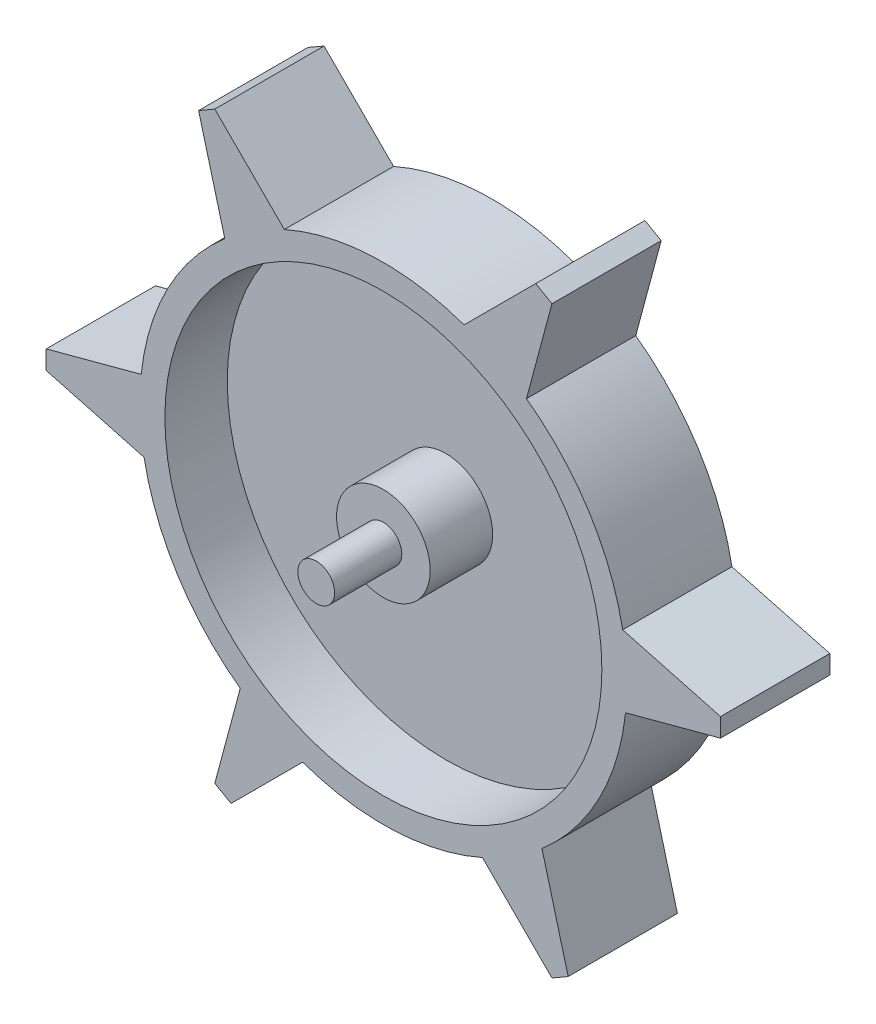
ISO-10303-21;
HEADER;
FILE_DESCRIPTION(('STEP AP214'),'2;1');
FILE_NAME('part.step','',(''),(''),'','','');
FILE_SCHEMA(('AUTOMOTIVE_DESIGN { 1 0 10303 214 1 1 1 1 }'));
ENDSEC;
DATA;
#1=APPLICATION_CONTEXT('core data for automotive mechanical design processes');
#2=APPLICATION_PROTOCOL_DEFINITION('international standard','automotive_design',2000,#1);
#3=PRODUCT_CONTEXT('',#1,'mechanical');
#4=PRODUCT('Part','Part','',(#3));
#5=PRODUCT_RELATED_PRODUCT_CATEGORY('part','',(#4));
#6=PRODUCT_DEFINITION_FORMATION('','',#4);
#7=PRODUCT_DEFINITION_CONTEXT('part definition',#1,'design');
#8=PRODUCT_DEFINITION('design','',#6,#7);
#9=PRODUCT_DEFINITION_SHAPE('','',#8);
#10=(LENGTH_UNIT() NAMED_UNIT(*) SI_UNIT(.MILLI.,.METRE.));
#11=(NAMED_UNIT(*) PLANE_ANGLE_UNIT() SI_UNIT($,.RADIAN.));
#12=(NAMED_UNIT(*) SI_UNIT($,.STERADIAN.) SOLID_ANGLE_UNIT());
#13=UNCERTAINTY_MEASURE_WITH_UNIT(LENGTH_MEASURE(1.E-05),#10,'distance_accuracy_value','');
#14=(GEOMETRIC_REPRESENTATION_CONTEXT(3) GLOBAL_UNCERTAINTY_ASSIGNED_CONTEXT((#13)) GLOBAL_UNIT_ASSIGNED_CONTEXT((#10,
#11,#12)) REPRESENTATION_CONTEXT('',''));
#15=CARTESIAN_POINT('',(0.,0.,0.));
#16=DIRECTION('',(0.,0.,1.));
#17=DIRECTION('',(1.,0.,0.));
#18=AXIS2_PLACEMENT_3D('',#15,#16,#17);
#19=CARTESIAN_POINT('',(0.,0.,17.5));
#20=DIRECTION('',(0.,0.,-1.));
#21=DIRECTION('',(-1.,0.,0.));
#22=AXIS2_PLACEMENT_3D('',#19,#20,#21);
#23=CYLINDRICAL_SURFACE('',#22,39.);
#24=DIRECTION('',(0.,0.,-1.));
#25=VECTOR('',#24,1.);
#26=CARTESIAN_POINT('',(-12.9305760104511,-36.7940240261642,17.5));
#27=LINE('',#26,#25);
#28=CARTESIAN_POINT('',(-12.930576010451,-36.7940240261642,17.5));
#29=VERTEX_POINT('',#28);
#30=CARTESIAN_POINT('',(-12.9305760104511,-36.7940240261642,0.));
#31=VERTEX_POINT('',#30);
#32=EDGE_CURVE('E381',#29,#31,#27,.T.);
#33=ORIENTED_EDGE('',*,*,#32,.T.);
#34=CARTESIAN_POINT('',(0.,0.,0.));
#35=DIRECTION('',(0.,0.,1.));
#36=DIRECTION('',(1.,0.,0.));
#37=AXIS2_PLACEMENT_3D('',#34,#35,#36);
#38=CIRCLE('',#37,39.);
#39=CARTESIAN_POINT('',(15.862848067013,-35.6282198713725,0.));
#40=VERTEX_POINT('',#39);
#41=EDGE_CURVE('E461',#31,#40,#38,.T.);
#42=ORIENTED_EDGE('',*,*,#41,.T.);
#43=DIRECTION('',(0.,0.,-1.));
#44=VECTOR('',#43,1.);
#45=CARTESIAN_POINT('',(15.862848067013,-35.6282198713725,17.5));
#46=LINE('',#45,#44);
#47=CARTESIAN_POINT('',(15.862848067013,-35.6282198713725,17.5));
#48=VERTEX_POINT('',#47);
#49=EDGE_CURVE('E364',#48,#40,#46,.T.);
#50=ORIENTED_EDGE('',*,*,#49,.F.);
#51=CARTESIAN_POINT('',(0.,0.,17.5));
#52=DIRECTION('',(0.,0.,1.));
#53=DIRECTION('',(1.,0.,0.));
#54=AXIS2_PLACEMENT_3D('',#51,#52,#53);
#55=CIRCLE('',#54,39.);
#56=EDGE_CURVE('E445',#29,#48,#55,.T.);
#57=ORIENTED_EDGE('',*,*,#56,.F.);
#58=EDGE_LOOP('',(#33,#42,#50,#57));
#59=FACE_BOUND('',#58,.T.);
#60=ADVANCED_FACE('F46',(#59),#23,.T.);
#61=DIRECTION('',(0.,0.,-1.));
#62=VECTOR('',#61,1.);
#63=CARTESIAN_POINT('',(38.3298475193387,7.19880470246576,17.5));
#64=LINE('',#63,#62);
#65=CARTESIAN_POINT('',(38.3298475193387,7.19880470246577,17.5));
#66=VERTEX_POINT('',#65);
#67=CARTESIAN_POINT('',(38.3298475193387,7.19880470246577,0.));
#68=VERTEX_POINT('',#67);
#69=EDGE_CURVE('E310',#66,#68,#64,.T.);
#70=ORIENTED_EDGE('',*,*,#69,.T.);
#71=CARTESIAN_POINT('',(22.9235194667195,31.5517393380925,0.));
#72=VERTEX_POINT('',#71);
#73=EDGE_CURVE('E545',#68,#72,#38,.T.);
#74=ORIENTED_EDGE('',*,*,#73,.T.);
#75=DIRECTION('',(0.,0.,-1.));
#76=VECTOR('',#75,1.);
#77=CARTESIAN_POINT('',(22.9235194667195,31.5517393380925,17.5));
#78=LINE('',#77,#76);
#79=CARTESIAN_POINT('',(22.9235194667195,31.5517393380925,17.5));
#80=VERTEX_POINT('',#79);
#81=EDGE_CURVE('E296',#80,#72,#78,.T.);
#82=ORIENTED_EDGE('',*,*,#81,.F.);
#83=EDGE_CURVE('E509',#66,#80,#55,.T.);
#84=ORIENTED_EDGE('',*,*,#83,.F.);
#85=EDGE_LOOP('',(#70,#74,#82,#84));
#86=FACE_BOUND('',#85,.T.);
#87=ADVANCED_FACE('F575',(#86),#23,.T.);
#88=DIRECTION('',(0.,0.,-1.));
#89=VECTOR('',#88,1.);
#90=CARTESIAN_POINT('',(-25.3992715088879,29.5952193236981,17.5));
#91=LINE('',#90,#89);
#92=CARTESIAN_POINT('',(-25.3992715088879,29.5952193236981,17.5));
#93=VERTEX_POINT('',#92);
#94=CARTESIAN_POINT('',(-25.3992715088879,29.5952193236981,0.));
#95=VERTEX_POINT('',#94);
#96=EDGE_CURVE('E254',#93,#95,#91,.T.);
#97=ORIENTED_EDGE('',*,*,#96,.T.);
#98=CARTESIAN_POINT('',(-38.7863675337326,4.07648053328027,0.));
#99=VERTEX_POINT('',#98);
#100=EDGE_CURVE('E439',#95,#99,#38,.T.);
#101=ORIENTED_EDGE('',*,*,#100,.T.);
#102=DIRECTION('',(0.,0.,-1.));
#103=VECTOR('',#102,1.);
#104=CARTESIAN_POINT('',(-38.7863675337326,4.07648053328027,17.5));
#105=LINE('',#104,#103);
#106=CARTESIAN_POINT('',(-38.7863675337326,4.07648053328027,17.5));
#107=VERTEX_POINT('',#106);
#108=EDGE_CURVE('E55',#107,#99,#105,.T.);
#109=ORIENTED_EDGE('',*,*,#108,.F.);
#110=EDGE_CURVE('E446',#93,#107,#55,.T.);
#111=ORIENTED_EDGE('',*,*,#110,.F.);
#112=EDGE_LOOP('',(#97,#101,#109,#111));
#113=FACE_BOUND('',#112,.T.);
#114=ADVANCED_FACE('F557',(#113),#23,.T.);
#115=CARTESIAN_POINT('',(12.9305760104508,36.7940240261643,0.));
#116=VERTEX_POINT('',#115);
#117=CARTESIAN_POINT('',(-15.8628480670133,35.6282198713724,0.));
#118=VERTEX_POINT('',#117);
#119=EDGE_CURVE('E549',#116,#118,#38,.T.);
#120=ORIENTED_EDGE('',*,*,#119,.T.);
#121=DIRECTION('',(0.,0.,-1.));
#122=VECTOR('',#121,1.);
#123=CARTESIAN_POINT('',(-15.8628480670133,35.6282198713724,17.5));
#124=LINE('',#123,#122);
#125=CARTESIAN_POINT('',(-15.8628480670133,35.6282198713724,17.5));
#126=VERTEX_POINT('',#125);
#127=EDGE_CURVE('E226',#126,#118,#124,.T.);
#128=ORIENTED_EDGE('',*,*,#127,.F.);
#129=CARTESIAN_POINT('',(12.9305760104508,36.7940240261643,17.5));
#130=VERTEX_POINT('',#129);
#131=EDGE_CURVE('E241',#130,#126,#55,.T.);
#132=ORIENTED_EDGE('',*,*,#131,.F.);
#133=DIRECTION('',(0.,0.,-1.));
#134=VECTOR('',#133,1.);
#135=CARTESIAN_POINT('',(12.9305760104508,36.7940240261643,17.5));
#136=LINE('',#135,#134);
#137=EDGE_CURVE('E277',#130,#116,#136,.T.);
#138=ORIENTED_EDGE('',*,*,#137,.T.);
#139=EDGE_LOOP('',(#120,#128,#132,#138));
#140=FACE_BOUND('',#139,.T.);
#141=ADVANCED_FACE('F568',(#140),#23,.T.);
#142=CARTESIAN_POINT('',(25.3992715088877,-29.5952193236983,0.));
#143=VERTEX_POINT('',#142);
#144=CARTESIAN_POINT('',(38.7863675337326,-4.07648053328028,0.));
#145=VERTEX_POINT('',#144);
#146=EDGE_CURVE('E541',#143,#145,#38,.T.);
#147=ORIENTED_EDGE('',*,*,#146,.T.);
#148=DIRECTION('',(0.,0.,-1.));
#149=VECTOR('',#148,1.);
#150=CARTESIAN_POINT('',(38.7863675337326,-4.07648053328027,17.5));
#151=LINE('',#150,#149);
#152=CARTESIAN_POINT('',(38.7863675337326,-4.07648053328028,17.5));
#153=VERTEX_POINT('',#152);
#154=EDGE_CURVE('E329',#153,#145,#151,.T.);
#155=ORIENTED_EDGE('',*,*,#154,.F.);
#156=CARTESIAN_POINT('',(25.3992715088877,-29.5952193236983,17.5));
#157=VERTEX_POINT('',#156);
#158=EDGE_CURVE('E512',#157,#153,#55,.T.);
#159=ORIENTED_EDGE('',*,*,#158,.F.);
#160=DIRECTION('',(0.,0.,-1.));
#161=VECTOR('',#160,1.);
#162=CARTESIAN_POINT('',(25.3992715088877,-29.5952193236983,17.5));
#163=LINE('',#162,#161);
#164=EDGE_CURVE('E345',#157,#143,#163,.T.);
#165=ORIENTED_EDGE('',*,*,#164,.T.);
#166=EDGE_LOOP('',(#147,#155,#159,#165));
#167=FACE_BOUND('',#166,.T.);
#168=ADVANCED_FACE('F539',(#167),#23,.T.);
#169=CARTESIAN_POINT('',(0.,0.,-10.75));
#170=DIRECTION('',(0.,0.,1.));
#171=DIRECTION('',(1.,0.,0.));
#172=AXIS2_PLACEMENT_3D('',#169,#170,#171);
#173=PLANE('',#172);
#174=CARTESIAN_POINT('',(0.,0.,-10.75));
#175=DIRECTION('',(0.,0.,1.));
#176=DIRECTION('',(1.,0.,0.));
#177=AXIS2_PLACEMENT_3D('',#174,#175,#176);
#178=CIRCLE('',#177,2.95);
#179=CARTESIAN_POINT('',(2.95,0.,-10.75));
#180=VERTEX_POINT('',#179);
#181=EDGE_CURVE('E427',#180,#180,#178,.T.);
#182=ORIENTED_EDGE('',*,*,#181,.F.);
#183=EDGE_LOOP('',(#182));
#184=FACE_BOUND('',#183,.T.);
#185=CARTESIAN_POINT('',(0.,0.,-10.75));
#186=DIRECTION('',(0.,0.,1.));
#187=DIRECTION('',(1.,0.,0.));
#188=AXIS2_PLACEMENT_3D('',#185,#186,#187);
#189=CIRCLE('',#188,1.7);
#190=CARTESIAN_POINT('',(1.22376468326227,-1.18,-10.75));
#191=VERTEX_POINT('',#190);
#192=CARTESIAN_POINT('',(-1.22376468326227,-1.18,-10.75));
#193=VERTEX_POINT('',#192);
#194=EDGE_CURVE('E405',#191,#193,#189,.T.);
#195=ORIENTED_EDGE('',*,*,#194,.T.);
#196=DIRECTION('',(-1.,0.,0.));
#197=VECTOR('',#196,1.);
#198=CARTESIAN_POINT('',(0.,-1.18,-10.75));
#199=LINE('',#198,#197);
#200=EDGE_CURVE('E410',#191,#193,#199,.T.);
#201=ORIENTED_EDGE('',*,*,#200,.F.);
#202=EDGE_LOOP('',(#195,#201));
#203=FACE_BOUND('',#202,.T.);
#204=ADVANCED_FACE('F574',(#184,#203),#173,.F.);
#205=CARTESIAN_POINT('',(-38.3298475193387,-7.19880470246576,0.));
#206=VERTEX_POINT('',#205);
#207=CARTESIAN_POINT('',(-22.9235194667197,-31.5517393380923,0.));
#208=VERTEX_POINT('',#207);
#209=EDGE_CURVE('E457',#206,#208,#38,.T.);
#210=ORIENTED_EDGE('',*,*,#209,.T.);
#211=DIRECTION('',(0.,0.,-1.));
#212=VECTOR('',#211,1.);
#213=CARTESIAN_POINT('',(-22.9235194667197,-31.5517393380923,17.5));
#214=LINE('',#213,#212);
#215=CARTESIAN_POINT('',(-22.9235194667197,-31.5517393380923,17.5));
#216=VERTEX_POINT('',#215);
#217=EDGE_CURVE('E401',#216,#208,#214,.T.);
#218=ORIENTED_EDGE('',*,*,#217,.F.);
#219=CARTESIAN_POINT('',(-38.3298475193387,-7.19880470246576,17.5));
#220=VERTEX_POINT('',#219);
#221=EDGE_CURVE('E440',#220,#216,#55,.T.);
#222=ORIENTED_EDGE('',*,*,#221,.F.);
#223=DIRECTION('',(0.,0.,-1.));
#224=VECTOR('',#223,1.);
#225=CARTESIAN_POINT('',(-38.3298475193387,-7.19880470246576,17.5));
#226=LINE('',#225,#224);
#227=EDGE_CURVE('E456',#220,#206,#226,.T.);
#228=ORIENTED_EDGE('',*,*,#227,.T.);
#229=EDGE_LOOP('',(#210,#218,#222,#228));
#230=FACE_BOUND('',#229,.T.);
#231=ADVANCED_FACE('F48',(#230),#23,.T.);
#232=CARTESIAN_POINT('',(-3.61731409782018,13.5,17.5));
#233=DIRECTION('',(-0.258819045102522,0.965925826289068,0.));
#234=DIRECTION('',(-0.965925826289068,-0.258819045102522,0.));
#235=AXIS2_PLACEMENT_3D('',#232,#233,#234);
#236=PLANE('',#235);
#237=DIRECTION('',(0.965925826289068,0.258819045102522,0.));
#238=VECTOR('',#237,1.);
#239=CARTESIAN_POINT('',(-3.61731409782018,13.5,0.));
#240=LINE('',#239,#238);
#241=CARTESIAN_POINT('',(-54.,0.,0.));
#242=VERTEX_POINT('',#241);
#243=EDGE_CURVE('E460',#242,#99,#240,.T.);
#244=ORIENTED_EDGE('',*,*,#243,.F.);
#245=DIRECTION('',(0.,0.,-1.));
#246=VECTOR('',#245,1.);
#247=CARTESIAN_POINT('',(-54.,0.,17.5));
#248=LINE('',#247,#246);
#249=CARTESIAN_POINT('',(-54.,0.,17.5));
#250=VERTEX_POINT('',#249);
#251=EDGE_CURVE('E478',#250,#242,#248,.T.);
#252=ORIENTED_EDGE('',*,*,#251,.F.);
#253=DIRECTION('',(0.965925826289068,0.258819045102522,0.));
#254=VECTOR('',#253,1.);
#255=CARTESIAN_POINT('',(-3.61731409782018,13.5,17.5));
#256=LINE('',#255,#254);
#257=EDGE_CURVE('E444',#250,#107,#256,.T.);
#258=ORIENTED_EDGE('',*,*,#257,.T.);
#259=ORIENTED_EDGE('',*,*,#108,.T.);
#260=EDGE_LOOP('',(#244,#252,#258,#259));
#261=FACE_BOUND('',#260,.T.);
#262=ADVANCED_FACE('F485',(#261),#236,.T.);
#263=CARTESIAN_POINT('',(-54.,0.,17.5));
#264=DIRECTION('',(1.,0.,0.));
#265=DIRECTION('',(0.,0.,-1.));
#266=AXIS2_PLACEMENT_3D('',#263,#264,#265);
#267=PLANE('',#266);
#268=DIRECTION('',(0.,-1.,0.));
#269=VECTOR('',#268,1.);
#270=CARTESIAN_POINT('',(-54.,0.,0.));
#271=LINE('',#270,#269);
#272=CARTESIAN_POINT('',(-54.,-3.,0.));
#273=VERTEX_POINT('',#272);
#274=EDGE_CURVE('E465',#242,#273,#271,.T.);
#275=ORIENTED_EDGE('',*,*,#274,.T.);
#276=DIRECTION('',(0.,0.,-1.));
#277=VECTOR('',#276,1.);
#278=CARTESIAN_POINT('',(-54.,-3.,17.5));
#279=LINE('',#278,#277);
#280=CARTESIAN_POINT('',(-54.,-3.,17.5));
#281=VERTEX_POINT('',#280);
#282=EDGE_CURVE('E474',#281,#273,#279,.T.);
#283=ORIENTED_EDGE('',*,*,#282,.F.);
#284=DIRECTION('',(0.,-1.,0.));
#285=VECTOR('',#284,1.);
#286=CARTESIAN_POINT('',(-54.,0.,17.5));
#287=LINE('',#286,#285);
#288=EDGE_CURVE('E450',#250,#281,#287,.T.);
#289=ORIENTED_EDGE('',*,*,#288,.F.);
#290=ORIENTED_EDGE('',*,*,#251,.T.);
#291=EDGE_LOOP('',(#275,#283,#289,#290));
#292=FACE_BOUND('',#291,.T.);
#293=ADVANCED_FACE('F498',(#292),#267,.F.);
#294=CARTESIAN_POINT('',(-4.36731409782018,-16.2990381056767,17.5));
#295=DIRECTION('',(0.258819045102522,0.965925826289068,0.));
#296=DIRECTION('',(-0.965925826289068,0.258819045102522,0.));
#297=AXIS2_PLACEMENT_3D('',#294,#295,#296);
#298=PLANE('',#297);
#299=DIRECTION('',(0.965925826289068,-0.258819045102522,0.));
#300=VECTOR('',#299,1.);
#301=CARTESIAN_POINT('',(-4.36731409782018,-16.2990381056767,0.));
#302=LINE('',#301,#300);
#303=EDGE_CURVE('E468',#273,#206,#302,.T.);
#304=ORIENTED_EDGE('',*,*,#303,.T.);
#305=ORIENTED_EDGE('',*,*,#227,.F.);
#306=DIRECTION('',(0.965925826289068,-0.258819045102522,0.));
#307=VECTOR('',#306,1.);
#308=CARTESIAN_POINT('',(-4.36731409782018,-16.2990381056767,17.5));
#309=LINE('',#308,#307);
#310=EDGE_CURVE('E453',#281,#220,#309,.T.);
#311=ORIENTED_EDGE('',*,*,#310,.F.);
#312=ORIENTED_EDGE('',*,*,#282,.T.);
#313=EDGE_LOOP('',(#304,#305,#311,#312));
#314=FACE_BOUND('',#313,.T.);
#315=ADVANCED_FACE('F502',(#314),#298,.F.);
#316=CARTESIAN_POINT('',(0.,0.,17.5));
#317=DIRECTION('',(0.,0.,1.));
#318=DIRECTION('',(1.,0.,0.));
#319=AXIS2_PLACEMENT_3D('',#316,#317,#318);
#320=PLANE('',#319);
#321=CARTESIAN_POINT('',(0.,0.,17.5));
#322=DIRECTION('',(0.,0.,1.));
#323=DIRECTION('',(1.,0.,0.));
#324=AXIS2_PLACEMENT_3D('',#321,#322,#323);
#325=CIRCLE('',#324,35.);
#326=CARTESIAN_POINT('',(35.,0.,17.5));
#327=VERTEX_POINT('',#326);
#328=EDGE_CURVE('E249',#327,#327,#325,.T.);
#329=ORIENTED_EDGE('',*,*,#328,.F.);
#330=EDGE_LOOP('',(#329));
#331=FACE_BOUND('',#330,.T.);
#332=ORIENTED_EDGE('',*,*,#110,.T.);
#333=ORIENTED_EDGE('',*,*,#257,.F.);
#334=ORIENTED_EDGE('',*,*,#288,.T.);
#335=ORIENTED_EDGE('',*,*,#310,.T.);
#336=ORIENTED_EDGE('',*,*,#221,.T.);
#337=DIRECTION('',(0.258819045102518,0.965925826289069,0.));
#338=VECTOR('',#337,1.);
#339=CARTESIAN_POINT('',(-13.5000000000001,3.61731409782013,17.5));
#340=LINE('',#339,#338);
#341=CARTESIAN_POINT('',(-26.9999999999999,-46.7653718043598,17.5));
#342=VERTEX_POINT('',#341);
#343=EDGE_CURVE('E369',#342,#216,#340,.T.);
#344=ORIENTED_EDGE('',*,*,#343,.F.);
#345=DIRECTION('',(0.86602540378444,-0.499999999999998,0.));
#346=VECTOR('',#345,1.);
#347=CARTESIAN_POINT('',(-26.9999999999999,-46.7653718043598,17.5));
#348=LINE('',#347,#346);
#349=CARTESIAN_POINT('',(-24.4019237886466,-48.2653718043597,17.5));
#350=VERTEX_POINT('',#349);
#351=EDGE_CURVE('E373',#342,#350,#348,.T.);
#352=ORIENTED_EDGE('',*,*,#351,.T.);
#353=DIRECTION('',(0.707106781186547,0.707106781186549,0.));
#354=VECTOR('',#353,1.);
#355=CARTESIAN_POINT('',(11.9317240078566,-11.9317240078565,17.5));
#356=LINE('',#355,#354);
#357=EDGE_CURVE('E377',#350,#29,#356,.T.);
#358=ORIENTED_EDGE('',*,*,#357,.T.);
#359=ORIENTED_EDGE('',*,*,#56,.T.);
#360=DIRECTION('',(-0.707106781186552,0.707106781186544,0.));
#361=VECTOR('',#360,1.);
#362=CARTESIAN_POINT('',(-9.88268590217982,-9.88268590217993,17.5));
#363=LINE('',#362,#361);
#364=CARTESIAN_POINT('',(27.0000000000002,-46.7653718043596,17.5));
#365=VERTEX_POINT('',#364);
#366=EDGE_CURVE('E333',#365,#48,#363,.T.);
#367=ORIENTED_EDGE('',*,*,#366,.F.);
#368=DIRECTION('',(0.866025403784436,0.500000000000004,0.));
#369=VECTOR('',#368,1.);
#370=CARTESIAN_POINT('',(27.0000000000002,-46.7653718043596,17.5));
#371=LINE('',#370,#369);
#372=CARTESIAN_POINT('',(29.5980762113535,-45.2653718043596,17.5));
#373=VERTEX_POINT('',#372);
#374=EDGE_CURVE('E337',#365,#373,#371,.T.);
#375=ORIENTED_EDGE('',*,*,#374,.T.);
#376=DIRECTION('',(-0.258819045102524,0.965925826289068,0.));
#377=VECTOR('',#376,1.);
#378=CARTESIAN_POINT('',(16.2990381056767,4.36731409782023,17.5));
#379=LINE('',#378,#377);
#380=EDGE_CURVE('E341',#373,#157,#379,.T.);
#381=ORIENTED_EDGE('',*,*,#380,.T.);
#382=ORIENTED_EDGE('',*,*,#158,.T.);
#383=DIRECTION('',(-0.965925826289068,-0.258819045102522,0.));
#384=VECTOR('',#383,1.);
#385=CARTESIAN_POINT('',(3.61731409782018,-13.5,17.5));
#386=LINE('',#385,#384);
#387=CARTESIAN_POINT('',(54.,0.,17.5));
#388=VERTEX_POINT('',#387);
#389=EDGE_CURVE('E300',#388,#153,#386,.T.);
#390=ORIENTED_EDGE('',*,*,#389,.F.);
#391=DIRECTION('',(0.,1.,0.));
#392=VECTOR('',#391,1.);
#393=CARTESIAN_POINT('',(54.,0.,17.5));
#394=LINE('',#393,#392);
#395=CARTESIAN_POINT('',(54.,3.,17.5));
#396=VERTEX_POINT('',#395);
#397=EDGE_CURVE('E303',#388,#396,#394,.T.);
#398=ORIENTED_EDGE('',*,*,#397,.T.);
#399=DIRECTION('',(-0.965925826289068,0.258819045102522,0.));
#400=VECTOR('',#399,1.);
#401=CARTESIAN_POINT('',(4.36731409782018,16.2990381056767,17.5));
#402=LINE('',#401,#400);
#403=EDGE_CURVE('E307',#396,#66,#402,.T.);
#404=ORIENTED_EDGE('',*,*,#403,.T.);
#405=ORIENTED_EDGE('',*,*,#83,.T.);
#406=DIRECTION('',(-0.258819045102511,-0.965925826289071,0.));
#407=VECTOR('',#406,1.);
#408=CARTESIAN_POINT('',(13.5000000000001,-3.61731409782003,17.5));
#409=LINE('',#408,#407);
#410=CARTESIAN_POINT('',(26.9999999999996,46.7653718043599,17.5));
#411=VERTEX_POINT('',#410);
#412=EDGE_CURVE('E70',#411,#80,#409,.T.);
#413=ORIENTED_EDGE('',*,*,#412,.F.);
#414=DIRECTION('',(-0.866025403784443,0.499999999999992,0.));
#415=VECTOR('',#414,1.);
#416=CARTESIAN_POINT('',(26.9999999999996,46.7653718043599,17.5));
#417=LINE('',#416,#415);
#418=CARTESIAN_POINT('',(24.4019237886462,48.2653718043599,17.5));
#419=VERTEX_POINT('',#418);
#420=EDGE_CURVE('E270',#411,#419,#417,.T.);
#421=ORIENTED_EDGE('',*,*,#420,.T.);
#422=DIRECTION('',(-0.707106781186542,-0.707106781186553,0.));
#423=VECTOR('',#422,1.);
#424=CARTESIAN_POINT('',(-11.9317240078566,11.9317240078564,17.5));
#425=LINE('',#424,#423);
#426=EDGE_CURVE('E274',#419,#130,#425,.T.);
#427=ORIENTED_EDGE('',*,*,#426,.T.);
#428=ORIENTED_EDGE('',*,*,#131,.T.);
#429=DIRECTION('',(0.707106781186556,-0.707106781186539,0.));
#430=VECTOR('',#429,1.);
#431=CARTESIAN_POINT('',(9.88268590217975,9.88268590218,17.5));
#432=LINE('',#431,#430);
#433=CARTESIAN_POINT('',(-27.0000000000005,46.7653718043594,17.5));
#434=VERTEX_POINT('',#433);
#435=EDGE_CURVE('E62',#434,#126,#432,.T.);
#436=ORIENTED_EDGE('',*,*,#435,.F.);
#437=DIRECTION('',(-0.866025403784433,-0.50000000000001,0.));
#438=VECTOR('',#437,1.);
#439=CARTESIAN_POINT('',(-27.0000000000005,46.7653718043594,17.5));
#440=LINE('',#439,#438);
#441=CARTESIAN_POINT('',(-29.5980762113538,45.2653718043593,17.5));
#442=VERTEX_POINT('',#441);
#443=EDGE_CURVE('E230',#434,#442,#440,.T.);
#444=ORIENTED_EDGE('',*,*,#443,.T.);
#445=DIRECTION('',(0.258819045102531,-0.965925826289066,0.));
#446=VECTOR('',#445,1.);
#447=CARTESIAN_POINT('',(-16.2990381056767,-4.36731409782034,17.5));
#448=LINE('',#447,#446);
#449=EDGE_CURVE('E236',#442,#93,#448,.T.);
#450=ORIENTED_EDGE('',*,*,#449,.T.);
#451=EDGE_LOOP('',(#332,#333,#334,#335,#336,#344,#352,#358,#359,#367,#375,#381,#382,#390,#398,
#404,#405,#413,#421,#427,#428,#436,#444,#450));
#452=FACE_BOUND('',#451,.T.);
#453=ADVANCED_FACE('F239',(#331,#452),#320,.T.);
#454=CARTESIAN_POINT('',(0.,0.,0.));
#455=DIRECTION('',(0.,0.,1.));
#456=DIRECTION('',(1.,0.,0.));
#457=AXIS2_PLACEMENT_3D('',#454,#455,#456);
#458=PLANE('',#457);
#459=CARTESIAN_POINT('',(0.,0.,0.));
#460=DIRECTION('',(0.,0.,1.));
#461=DIRECTION('',(1.,0.,0.));
#462=AXIS2_PLACEMENT_3D('',#459,#460,#461);
#463=CIRCLE('',#462,2.95);
#464=CARTESIAN_POINT('',(2.95,0.,0.));
#465=VERTEX_POINT('',#464);
#466=EDGE_CURVE('E11',#465,#465,#463,.F.);
#467=ORIENTED_EDGE('',*,*,#466,.F.);
#468=EDGE_LOOP('',(#467));
#469=FACE_BOUND('',#468,.T.);
#470=ORIENTED_EDGE('',*,*,#209,.F.);
#471=ORIENTED_EDGE('',*,*,#303,.F.);
#472=ORIENTED_EDGE('',*,*,#274,.F.);
#473=ORIENTED_EDGE('',*,*,#243,.T.);
#474=ORIENTED_EDGE('',*,*,#100,.F.);
#475=DIRECTION('',(0.258819045102531,-0.965925826289066,0.));
#476=VECTOR('',#475,1.);
#477=CARTESIAN_POINT('',(-16.2990381056767,-4.36731409782034,0.));
#478=LINE('',#477,#476);
#479=CARTESIAN_POINT('',(-29.5980762113538,45.2653718043593,0.));
#480=VERTEX_POINT('',#479);
#481=EDGE_CURVE('E243',#480,#95,#478,.T.);
#482=ORIENTED_EDGE('',*,*,#481,.F.);
#483=DIRECTION('',(-0.866025403784433,-0.50000000000001,0.));
#484=VECTOR('',#483,1.);
#485=CARTESIAN_POINT('',(-27.0000000000005,46.7653718043594,0.));
#486=LINE('',#485,#484);
#487=CARTESIAN_POINT('',(-27.0000000000005,46.7653718043594,0.));
#488=VERTEX_POINT('',#487);
#489=EDGE_CURVE('E246',#488,#480,#486,.T.);
#490=ORIENTED_EDGE('',*,*,#489,.F.);
#491=DIRECTION('',(0.707106781186556,-0.707106781186539,0.));
#492=VECTOR('',#491,1.);
#493=CARTESIAN_POINT('',(9.88268590217975,9.88268590218,0.));
#494=LINE('',#493,#492);
#495=EDGE_CURVE('E222',#488,#118,#494,.T.);
#496=ORIENTED_EDGE('',*,*,#495,.T.);
#497=ORIENTED_EDGE('',*,*,#119,.F.);
#498=DIRECTION('',(-0.707106781186542,-0.707106781186553,0.));
#499=VECTOR('',#498,1.);
#500=CARTESIAN_POINT('',(-11.9317240078566,11.9317240078564,0.));
#501=LINE('',#500,#499);
#502=CARTESIAN_POINT('',(24.4019237886462,48.2653718043599,0.));
#503=VERTEX_POINT('',#502);
#504=EDGE_CURVE('E271',#503,#116,#501,.T.);
#505=ORIENTED_EDGE('',*,*,#504,.F.);
#506=DIRECTION('',(-0.866025403784443,0.499999999999992,0.));
#507=VECTOR('',#506,1.);
#508=CARTESIAN_POINT('',(26.9999999999996,46.7653718043599,0.));
#509=LINE('',#508,#507);
#510=CARTESIAN_POINT('',(26.9999999999996,46.7653718043599,0.));
#511=VERTEX_POINT('',#510);
#512=EDGE_CURVE('E281',#511,#503,#509,.T.);
#513=ORIENTED_EDGE('',*,*,#512,.F.);
#514=DIRECTION('',(-0.258819045102511,-0.965925826289071,0.));
#515=VECTOR('',#514,1.);
#516=CARTESIAN_POINT('',(13.5000000000001,-3.61731409782003,0.));
#517=LINE('',#516,#515);
#518=EDGE_CURVE('E267',#511,#72,#517,.T.);
#519=ORIENTED_EDGE('',*,*,#518,.T.);
#520=ORIENTED_EDGE('',*,*,#73,.F.);
#521=DIRECTION('',(-0.965925826289068,0.258819045102522,0.));
#522=VECTOR('',#521,1.);
#523=CARTESIAN_POINT('',(4.36731409782018,16.2990381056767,0.));
#524=LINE('',#523,#522);
#525=CARTESIAN_POINT('',(54.,3.,0.));
#526=VERTEX_POINT('',#525);
#527=EDGE_CURVE('E304',#526,#68,#524,.T.);
#528=ORIENTED_EDGE('',*,*,#527,.F.);
#529=DIRECTION('',(0.,1.,0.));
#530=VECTOR('',#529,1.);
#531=CARTESIAN_POINT('',(54.,0.,0.));
#532=LINE('',#531,#530);
#533=CARTESIAN_POINT('',(54.,0.,0.));
#534=VERTEX_POINT('',#533);
#535=EDGE_CURVE('E314',#534,#526,#532,.T.);
#536=ORIENTED_EDGE('',*,*,#535,.F.);
#537=DIRECTION('',(-0.965925826289068,-0.258819045102522,0.));
#538=VECTOR('',#537,1.);
#539=CARTESIAN_POINT('',(3.61731409782018,-13.5,0.));
#540=LINE('',#539,#538);
#541=EDGE_CURVE('E299',#534,#145,#540,.T.);
#542=ORIENTED_EDGE('',*,*,#541,.T.);
#543=ORIENTED_EDGE('',*,*,#146,.F.);
#544=DIRECTION('',(-0.258819045102524,0.965925826289068,0.));
#545=VECTOR('',#544,1.);
#546=CARTESIAN_POINT('',(16.2990381056767,4.36731409782023,0.));
#547=LINE('',#546,#545);
#548=CARTESIAN_POINT('',(29.5980762113535,-45.2653718043596,0.));
#549=VERTEX_POINT('',#548);
#550=EDGE_CURVE('E338',#549,#143,#547,.T.);
#551=ORIENTED_EDGE('',*,*,#550,.F.);
#552=DIRECTION('',(0.866025403784436,0.500000000000004,0.));
#553=VECTOR('',#552,1.);
#554=CARTESIAN_POINT('',(27.0000000000002,-46.7653718043596,0.));
#555=LINE('',#554,#553);
#556=CARTESIAN_POINT('',(27.0000000000002,-46.7653718043596,0.));
#557=VERTEX_POINT('',#556);
#558=EDGE_CURVE('E349',#557,#549,#555,.T.);
#559=ORIENTED_EDGE('',*,*,#558,.F.);
#560=DIRECTION('',(-0.707106781186552,0.707106781186544,0.));
#561=VECTOR('',#560,1.);
#562=CARTESIAN_POINT('',(-9.88268590217982,-9.88268590217993,0.));
#563=LINE('',#562,#561);
#564=EDGE_CURVE('E332',#557,#40,#563,.T.);
#565=ORIENTED_EDGE('',*,*,#564,.T.);
#566=ORIENTED_EDGE('',*,*,#41,.F.);
#567=DIRECTION('',(0.707106781186547,0.707106781186549,0.));
#568=VECTOR('',#567,1.);
#569=CARTESIAN_POINT('',(11.9317240078566,-11.9317240078565,0.));
#570=LINE('',#569,#568);
#571=CARTESIAN_POINT('',(-24.4019237886466,-48.2653718043597,0.));
#572=VERTEX_POINT('',#571);
#573=EDGE_CURVE('E374',#572,#31,#570,.T.);
#574=ORIENTED_EDGE('',*,*,#573,.F.);
#575=DIRECTION('',(0.86602540378444,-0.499999999999998,0.));
#576=VECTOR('',#575,1.);
#577=CARTESIAN_POINT('',(-26.9999999999999,-46.7653718043598,0.));
#578=LINE('',#577,#576);
#579=CARTESIAN_POINT('',(-26.9999999999999,-46.7653718043598,0.));
#580=VERTEX_POINT('',#579);
#581=EDGE_CURVE('E385',#580,#572,#578,.T.);
#582=ORIENTED_EDGE('',*,*,#581,.F.);
#583=DIRECTION('',(0.258819045102518,0.965925826289069,0.));
#584=VECTOR('',#583,1.);
#585=CARTESIAN_POINT('',(-13.5000000000001,3.61731409782013,0.));
#586=LINE('',#585,#584);
#587=EDGE_CURVE('E368',#580,#208,#586,.T.);
#588=ORIENTED_EDGE('',*,*,#587,.T.);
#589=EDGE_LOOP('',(#470,#471,#472,#473,#474,#482,#490,#496,#497,#505,#513,#519,#520,#528,#536,
#542,#543,#551,#559,#565,#566,#574,#582,#588));
#590=FACE_BOUND('',#589,.T.);
#591=ADVANCED_FACE('F493',(#469,#590),#458,.F.);
#592=CARTESIAN_POINT('',(0.,0.,28.25));
#593=DIRECTION('',(0.,0.,-1.));
#594=DIRECTION('',(-1.,0.,0.));
#595=AXIS2_PLACEMENT_3D('',#592,#593,#594);
#596=CYLINDRICAL_SURFACE('',#595,2.95);
#597=ORIENTED_EDGE('',*,*,#181,.T.);
#598=EDGE_LOOP('',(#597));
#599=FACE_BOUND('',#598,.T.);
#600=ORIENTED_EDGE('',*,*,#466,.T.);
#601=EDGE_LOOP('',(#600));
#602=FACE_BOUND('',#601,.T.);
#603=ADVANCED_FACE('F626',(#599,#602),#596,.T.);
#604=CARTESIAN_POINT('',(0.,0.,-3.25));
#605=DIRECTION('',(0.,0.,-1.));
#606=DIRECTION('',(-1.,0.,0.));
#607=AXIS2_PLACEMENT_3D('',#604,#605,#606);
#608=CYLINDRICAL_SURFACE('',#607,1.7);
#609=ORIENTED_EDGE('',*,*,#194,.F.);
#610=DIRECTION('',(0.,0.,-1.));
#611=VECTOR('',#610,1.);
#612=CARTESIAN_POINT('',(1.22376468326227,-1.18,-3.25));
#613=LINE('',#612,#611);
#614=CARTESIAN_POINT('',(1.22376468326227,-1.18,-3.25));
#615=VERTEX_POINT('',#614);
#616=EDGE_CURVE('E414',#615,#191,#613,.T.);
#617=ORIENTED_EDGE('',*,*,#616,.F.);
#618=CARTESIAN_POINT('',(0.,0.,-3.25));
#619=DIRECTION('',(0.,0.,1.));
#620=DIRECTION('',(1.,0.,0.));
#621=AXIS2_PLACEMENT_3D('',#618,#619,#620);
#622=CIRCLE('',#621,1.7);
#623=CARTESIAN_POINT('',(-1.22376468326227,-1.18,-3.25));
#624=VERTEX_POINT('',#623);
#625=EDGE_CURVE('E406',#615,#624,#622,.T.);
#626=ORIENTED_EDGE('',*,*,#625,.T.);
#627=DIRECTION('',(0.,0.,-1.));
#628=VECTOR('',#627,1.);
#629=CARTESIAN_POINT('',(-1.22376468326227,-1.18,-3.25));
#630=LINE('',#629,#628);
#631=EDGE_CURVE('E424',#624,#193,#630,.T.);
#632=ORIENTED_EDGE('',*,*,#631,.T.);
#633=EDGE_LOOP('',(#609,#617,#626,#632));
#634=FACE_BOUND('',#633,.T.);
#635=ADVANCED_FACE('F623',(#634),#608,.F.);
#636=CARTESIAN_POINT('',(0.,-1.18,-3.25));
#637=DIRECTION('',(0.,-1.,0.));
#638=DIRECTION('',(0.,0.,-1.));
#639=AXIS2_PLACEMENT_3D('',#636,#637,#638);
#640=PLANE('',#639);
#641=ORIENTED_EDGE('',*,*,#200,.T.);
#642=ORIENTED_EDGE('',*,*,#631,.F.);
#643=DIRECTION('',(-1.,0.,0.));
#644=VECTOR('',#643,1.);
#645=CARTESIAN_POINT('',(0.,-1.18,-3.25));
#646=LINE('',#645,#644);
#647=EDGE_CURVE('E409',#615,#624,#646,.T.);
#648=ORIENTED_EDGE('',*,*,#647,.F.);
#649=ORIENTED_EDGE('',*,*,#616,.T.);
#650=EDGE_LOOP('',(#641,#642,#648,#649));
#651=FACE_BOUND('',#650,.T.);
#652=ADVANCED_FACE('F619',(#651),#640,.F.);
#653=CARTESIAN_POINT('',(0.,0.,-3.25));
#654=DIRECTION('',(0.,0.,1.));
#655=DIRECTION('',(1.,0.,0.));
#656=AXIS2_PLACEMENT_3D('',#653,#654,#655);
#657=PLANE('',#656);
#658=ORIENTED_EDGE('',*,*,#625,.F.);
#659=ORIENTED_EDGE('',*,*,#647,.T.);
#660=EDGE_LOOP('',(#658,#659));
#661=FACE_BOUND('',#660,.T.);
#662=ADVANCED_FACE('F616',(#661),#657,.F.);
#663=CARTESIAN_POINT('',(27.0000000000002,-46.7653718043596,17.5));
#664=DIRECTION('',(-0.500000000000004,0.866025403784436,0.));
#665=DIRECTION('',(-0.866025403784436,-0.500000000000004,0.));
#666=AXIS2_PLACEMENT_3D('',#663,#664,#665);
#667=PLANE('',#666);
#668=ORIENTED_EDGE('',*,*,#558,.T.);
#669=DIRECTION('',(0.,0.,-1.));
#670=VECTOR('',#669,1.);
#671=CARTESIAN_POINT('',(29.5980762113535,-45.2653718043596,17.5));
#672=LINE('',#671,#670);
#673=EDGE_CURVE('E357',#373,#549,#672,.T.);
#674=ORIENTED_EDGE('',*,*,#673,.F.);
#675=ORIENTED_EDGE('',*,*,#374,.F.);
#676=DIRECTION('',(0.,0.,-1.));
#677=VECTOR('',#676,1.);
#678=CARTESIAN_POINT('',(27.0000000000002,-46.7653718043596,17.5));
#679=LINE('',#678,#677);
#680=EDGE_CURVE('E361',#365,#557,#679,.T.);
#681=ORIENTED_EDGE('',*,*,#680,.T.);
#682=EDGE_LOOP('',(#668,#674,#675,#681));
#683=FACE_BOUND('',#682,.T.);
#684=ADVANCED_FACE('F530',(#683),#667,.F.);
#685=CARTESIAN_POINT('',(16.2990381056767,4.36731409782023,17.5));
#686=DIRECTION('',(-0.965925826289067,-0.258819045102524,0.));
#687=DIRECTION('',(0.258819045102524,-0.965925826289068,0.));
#688=AXIS2_PLACEMENT_3D('',#685,#686,#687);
#689=PLANE('',#688);
#690=ORIENTED_EDGE('',*,*,#550,.T.);
#691=ORIENTED_EDGE('',*,*,#164,.F.);
#692=ORIENTED_EDGE('',*,*,#380,.F.);
#693=ORIENTED_EDGE('',*,*,#673,.T.);
#694=EDGE_LOOP('',(#690,#691,#692,#693));
#695=FACE_BOUND('',#694,.T.);
#696=ADVANCED_FACE('F534',(#695),#689,.F.);
#697=CARTESIAN_POINT('',(-9.88268590217982,-9.88268590217993,17.5));
#698=DIRECTION('',(-0.707106781186544,-0.707106781186551,0.));
#699=DIRECTION('',(0.707106781186551,-0.707106781186544,0.));
#700=AXIS2_PLACEMENT_3D('',#697,#698,#699);
#701=PLANE('',#700);
#702=ORIENTED_EDGE('',*,*,#564,.F.);
#703=ORIENTED_EDGE('',*,*,#680,.F.);
#704=ORIENTED_EDGE('',*,*,#366,.T.);
#705=ORIENTED_EDGE('',*,*,#49,.T.);
#706=EDGE_LOOP('',(#702,#703,#704,#705));
#707=FACE_BOUND('',#706,.T.);
#708=ADVANCED_FACE('F525',(#707),#701,.T.);
#709=CARTESIAN_POINT('',(26.9999999999996,46.7653718043599,17.5));
#710=DIRECTION('',(-0.499999999999992,-0.866025403784443,0.));
#711=DIRECTION('',(0.866025403784443,-0.499999999999992,0.));
#712=AXIS2_PLACEMENT_3D('',#709,#710,#711);
#713=PLANE('',#712);
#714=ORIENTED_EDGE('',*,*,#512,.T.);
#715=DIRECTION('',(0.,0.,-1.));
#716=VECTOR('',#715,1.);
#717=CARTESIAN_POINT('',(24.4019237886462,48.2653718043599,17.5));
#718=LINE('',#717,#716);
#719=EDGE_CURVE('E289',#419,#503,#718,.T.);
#720=ORIENTED_EDGE('',*,*,#719,.F.);
#721=ORIENTED_EDGE('',*,*,#420,.F.);
#722=DIRECTION('',(0.,0.,-1.));
#723=VECTOR('',#722,1.);
#724=CARTESIAN_POINT('',(26.9999999999996,46.7653718043599,17.5));
#725=LINE('',#724,#723);
#726=EDGE_CURVE('E293',#411,#511,#725,.T.);
#727=ORIENTED_EDGE('',*,*,#726,.T.);
#728=EDGE_LOOP('',(#714,#720,#721,#727));
#729=FACE_BOUND('',#728,.T.);
#730=ADVANCED_FACE('F702',(#729),#713,.F.);
#731=CARTESIAN_POINT('',(-11.9317240078566,11.9317240078564,17.5));
#732=DIRECTION('',(0.707106781186553,-0.707106781186542,0.));
#733=DIRECTION('',(0.707106781186542,0.707106781186553,0.));
#734=AXIS2_PLACEMENT_3D('',#731,#732,#733);
#735=PLANE('',#734);
#736=ORIENTED_EDGE('',*,*,#504,.T.);
#737=ORIENTED_EDGE('',*,*,#137,.F.);
#738=ORIENTED_EDGE('',*,*,#426,.F.);
#739=ORIENTED_EDGE('',*,*,#719,.T.);
#740=EDGE_LOOP('',(#736,#737,#738,#739));
#741=FACE_BOUND('',#740,.T.);
#742=ADVANCED_FACE('F565',(#741),#735,.F.);
#743=CARTESIAN_POINT('',(13.5000000000001,-3.61731409782003,17.5));
#744=DIRECTION('',(0.965925826289071,-0.258819045102511,0.));
#745=DIRECTION('',(0.258819045102511,0.965925826289071,0.));
#746=AXIS2_PLACEMENT_3D('',#743,#744,#745);
#747=PLANE('',#746);
#748=ORIENTED_EDGE('',*,*,#518,.F.);
#749=ORIENTED_EDGE('',*,*,#726,.F.);
#750=ORIENTED_EDGE('',*,*,#412,.T.);
#751=ORIENTED_EDGE('',*,*,#81,.T.);
#752=EDGE_LOOP('',(#748,#749,#750,#751));
#753=FACE_BOUND('',#752,.T.);
#754=ADVANCED_FACE('F715',(#753),#747,.T.);
#755=CARTESIAN_POINT('',(-27.0000000000005,46.7653718043594,17.5));
#756=DIRECTION('',(0.50000000000001,-0.866025403784433,0.));
#757=DIRECTION('',(0.866025403784433,0.50000000000001,0.));
#758=AXIS2_PLACEMENT_3D('',#755,#756,#757);
#759=PLANE('',#758);
#760=ORIENTED_EDGE('',*,*,#489,.T.);
#761=DIRECTION('',(0.,0.,-1.));
#762=VECTOR('',#761,1.);
#763=CARTESIAN_POINT('',(-29.5980762113538,45.2653718043593,17.5));
#764=LINE('',#763,#762);
#765=EDGE_CURVE('E227',#442,#480,#764,.T.);
#766=ORIENTED_EDGE('',*,*,#765,.F.);
#767=ORIENTED_EDGE('',*,*,#443,.F.);
#768=DIRECTION('',(0.,0.,-1.));
#769=VECTOR('',#768,1.);
#770=CARTESIAN_POINT('',(-27.0000000000005,46.7653718043594,17.5));
#771=LINE('',#770,#769);
#772=EDGE_CURVE('E218',#434,#488,#771,.T.);
#773=ORIENTED_EDGE('',*,*,#772,.T.);
#774=EDGE_LOOP('',(#760,#766,#767,#773));
#775=FACE_BOUND('',#774,.T.);
#776=ADVANCED_FACE('F231',(#775),#759,.F.);
#777=CARTESIAN_POINT('',(-16.2990381056767,-4.36731409782034,17.5));
#778=DIRECTION('',(0.965925826289065,0.258819045102531,0.));
#779=DIRECTION('',(-0.258819045102531,0.965925826289066,0.));
#780=AXIS2_PLACEMENT_3D('',#777,#778,#779);
#781=PLANE('',#780);
#782=ORIENTED_EDGE('',*,*,#481,.T.);
#783=ORIENTED_EDGE('',*,*,#96,.F.);
#784=ORIENTED_EDGE('',*,*,#449,.F.);
#785=ORIENTED_EDGE('',*,*,#765,.T.);
#786=EDGE_LOOP('',(#782,#783,#784,#785));
#787=FACE_BOUND('',#786,.T.);
#788=ADVANCED_FACE('F559',(#787),#781,.F.);
#789=CARTESIAN_POINT('',(9.88268590217975,9.88268590218,17.5));
#790=DIRECTION('',(0.707106781186539,0.707106781186556,0.));
#791=DIRECTION('',(-0.707106781186556,0.707106781186539,0.));
#792=AXIS2_PLACEMENT_3D('',#789,#790,#791);
#793=PLANE('',#792);
#794=ORIENTED_EDGE('',*,*,#495,.F.);
#795=ORIENTED_EDGE('',*,*,#772,.F.);
#796=ORIENTED_EDGE('',*,*,#435,.T.);
#797=ORIENTED_EDGE('',*,*,#127,.T.);
#798=EDGE_LOOP('',(#794,#795,#796,#797));
#799=FACE_BOUND('',#798,.T.);
#800=ADVANCED_FACE('F220',(#799),#793,.T.);
#801=CARTESIAN_POINT('',(54.,0.,17.5));
#802=DIRECTION('',(-1.,0.,0.));
#803=DIRECTION('',(0.,0.,1.));
#804=AXIS2_PLACEMENT_3D('',#801,#802,#803);
#805=PLANE('',#804);
#806=ORIENTED_EDGE('',*,*,#535,.T.);
#807=DIRECTION('',(0.,0.,-1.));
#808=VECTOR('',#807,1.);
#809=CARTESIAN_POINT('',(54.,3.,17.5));
#810=LINE('',#809,#808);
#811=EDGE_CURVE('E322',#396,#526,#810,.T.);
#812=ORIENTED_EDGE('',*,*,#811,.F.);
#813=ORIENTED_EDGE('',*,*,#397,.F.);
#814=DIRECTION('',(0.,0.,-1.));
#815=VECTOR('',#814,1.);
#816=CARTESIAN_POINT('',(54.,0.,17.5));
#817=LINE('',#816,#815);
#818=EDGE_CURVE('E326',#388,#534,#817,.T.);
#819=ORIENTED_EDGE('',*,*,#818,.T.);
#820=EDGE_LOOP('',(#806,#812,#813,#819));
#821=FACE_BOUND('',#820,.T.);
#822=ADVANCED_FACE('F740',(#821),#805,.F.);
#823=CARTESIAN_POINT('',(4.36731409782018,16.2990381056767,17.5));
#824=DIRECTION('',(-0.258819045102522,-0.965925826289068,0.));
#825=DIRECTION('',(0.965925826289068,-0.258819045102522,0.));
#826=AXIS2_PLACEMENT_3D('',#823,#824,#825);
#827=PLANE('',#826);
#828=ORIENTED_EDGE('',*,*,#527,.T.);
#829=ORIENTED_EDGE('',*,*,#69,.F.);
#830=ORIENTED_EDGE('',*,*,#403,.F.);
#831=ORIENTED_EDGE('',*,*,#811,.T.);
#832=EDGE_LOOP('',(#828,#829,#830,#831));
#833=FACE_BOUND('',#832,.T.);
#834=ADVANCED_FACE('F747',(#833),#827,.F.);
#835=CARTESIAN_POINT('',(3.61731409782018,-13.5,17.5));
#836=DIRECTION('',(0.258819045102522,-0.965925826289068,0.));
#837=DIRECTION('',(0.965925826289068,0.258819045102522,0.));
#838=AXIS2_PLACEMENT_3D('',#835,#836,#837);
#839=PLANE('',#838);
#840=ORIENTED_EDGE('',*,*,#541,.F.);
#841=ORIENTED_EDGE('',*,*,#818,.F.);
#842=ORIENTED_EDGE('',*,*,#389,.T.);
#843=ORIENTED_EDGE('',*,*,#154,.T.);
#844=EDGE_LOOP('',(#840,#841,#842,#843));
#845=FACE_BOUND('',#844,.T.);
#846=ADVANCED_FACE('F615',(#845),#839,.T.);
#847=CARTESIAN_POINT('',(-13.5000000000001,3.61731409782013,17.5));
#848=DIRECTION('',(-0.965925826289069,0.258819045102518,0.));
#849=DIRECTION('',(-0.258819045102518,-0.965925826289069,0.));
#850=AXIS2_PLACEMENT_3D('',#847,#848,#849);
#851=PLANE('',#850);
#852=ORIENTED_EDGE('',*,*,#587,.F.);
#853=DIRECTION('',(0.,0.,-1.));
#854=VECTOR('',#853,1.);
#855=CARTESIAN_POINT('',(-26.9999999999999,-46.7653718043598,17.5));
#856=LINE('',#855,#854);
#857=EDGE_CURVE('E398',#342,#580,#856,.T.);
#858=ORIENTED_EDGE('',*,*,#857,.F.);
#859=ORIENTED_EDGE('',*,*,#343,.T.);
#860=ORIENTED_EDGE('',*,*,#217,.T.);
#861=EDGE_LOOP('',(#852,#858,#859,#860));
#862=FACE_BOUND('',#861,.T.);
#863=ADVANCED_FACE('F590',(#862),#851,.T.);
#864=CARTESIAN_POINT('',(-26.9999999999999,-46.7653718043598,17.5));
#865=DIRECTION('',(0.499999999999998,0.86602540378444,0.));
#866=DIRECTION('',(-0.86602540378444,0.499999999999998,0.));
#867=AXIS2_PLACEMENT_3D('',#864,#865,#866);
#868=PLANE('',#867);
#869=ORIENTED_EDGE('',*,*,#581,.T.);
#870=DIRECTION('',(0.,0.,-1.));
#871=VECTOR('',#870,1.);
#872=CARTESIAN_POINT('',(-24.4019237886466,-48.2653718043597,17.5));
#873=LINE('',#872,#871);
#874=EDGE_CURVE('E394',#350,#572,#873,.T.);
#875=ORIENTED_EDGE('',*,*,#874,.F.);
#876=ORIENTED_EDGE('',*,*,#351,.F.);
#877=ORIENTED_EDGE('',*,*,#857,.T.);
#878=EDGE_LOOP('',(#869,#875,#876,#877));
#879=FACE_BOUND('',#878,.T.);
#880=ADVANCED_FACE('F595',(#879),#868,.F.);
#881=CARTESIAN_POINT('',(11.9317240078566,-11.9317240078565,17.5));
#882=DIRECTION('',(-0.707106781186549,0.707106781186547,0.));
#883=DIRECTION('',(-0.707106781186546,-0.707106781186549,0.));
#884=AXIS2_PLACEMENT_3D('',#881,#882,#883);
#885=PLANE('',#884);
#886=ORIENTED_EDGE('',*,*,#573,.T.);
#887=ORIENTED_EDGE('',*,*,#32,.F.);
#888=ORIENTED_EDGE('',*,*,#357,.F.);
#889=ORIENTED_EDGE('',*,*,#874,.T.);
#890=EDGE_LOOP('',(#886,#887,#888,#889));
#891=FACE_BOUND('',#890,.T.);
#892=ADVANCED_FACE('F598',(#891),#885,.F.);
#893=CARTESIAN_POINT('',(0.,0.,7.5));
#894=DIRECTION('',(0.,0.,1.));
#895=DIRECTION('',(1.,0.,0.));
#896=AXIS2_PLACEMENT_3D('',#893,#894,#895);
#897=CYLINDRICAL_SURFACE('',#896,35.);
#898=CARTESIAN_POINT('',(0.,0.,7.5));
#899=DIRECTION('',(0.,0.,1.));
#900=DIRECTION('',(1.,0.,0.));
#901=AXIS2_PLACEMENT_3D('',#898,#899,#900);
#902=CIRCLE('',#901,35.);
#903=CARTESIAN_POINT('',(35.,0.,7.5));
#904=VERTEX_POINT('',#903);
#905=EDGE_CURVE('E257',#904,#904,#902,.T.);
#906=ORIENTED_EDGE('',*,*,#905,.F.);
#907=EDGE_LOOP('',(#906));
#908=FACE_BOUND('',#907,.T.);
#909=ORIENTED_EDGE('',*,*,#328,.T.);
#910=EDGE_LOOP('',(#909));
#911=FACE_BOUND('',#910,.T.);
#912=ADVANCED_FACE('F600',(#908,#911),#897,.F.);
#913=CARTESIAN_POINT('',(0.,0.,7.5));
#914=DIRECTION('',(0.,0.,1.));
#915=DIRECTION('',(1.,0.,0.));
#916=AXIS2_PLACEMENT_3D('',#913,#914,#915);
#917=PLANE('',#916);
#918=CARTESIAN_POINT('',(0.,0.,7.5));
#919=DIRECTION('',(0.,0.,1.));
#920=DIRECTION('',(1.,0.,0.));
#921=AXIS2_PLACEMENT_3D('',#918,#919,#920);
#922=CIRCLE('',#921,7.5);
#923=CARTESIAN_POINT('',(7.5,0.,7.5));
#924=VERTEX_POINT('',#923);
#925=EDGE_CURVE('E1402',#924,#924,#922,.T.);
#926=ORIENTED_EDGE('',*,*,#925,.F.);
#927=EDGE_LOOP('',(#926));
#928=FACE_BOUND('',#927,.T.);
#929=ORIENTED_EDGE('',*,*,#905,.T.);
#930=EDGE_LOOP('',(#929));
#931=FACE_BOUND('',#930,.T.);
#932=ADVANCED_FACE('F606',(#928,#931),#917,.T.);
#933=CARTESIAN_POINT('',(0.,0.,7.5));
#934=DIRECTION('',(0.,0.,1.));
#935=DIRECTION('',(1.,0.,0.));
#936=AXIS2_PLACEMENT_3D('',#933,#934,#935);
#937=CYLINDRICAL_SURFACE('',#936,7.5);
#938=ORIENTED_EDGE('',*,*,#925,.T.);
#939=EDGE_LOOP('',(#938));
#940=FACE_BOUND('',#939,.T.);
#941=CARTESIAN_POINT('',(0.,0.,17.5));
#942=DIRECTION('',(0.,0.,1.));
#943=DIRECTION('',(1.,0.,0.));
#944=AXIS2_PLACEMENT_3D('',#941,#942,#943);
#945=CIRCLE('',#944,7.5);
#946=CARTESIAN_POINT('',(7.5,0.,17.5));
#947=VERTEX_POINT('',#946);
#948=EDGE_CURVE('E1405',#947,#947,#945,.T.);
#949=ORIENTED_EDGE('',*,*,#948,.F.);
#950=EDGE_LOOP('',(#949));
#951=FACE_BOUND('',#950,.T.);
#952=ADVANCED_FACE('F633',(#940,#951),#937,.T.);
#953=CARTESIAN_POINT('',(0.,0.,28.25));
#954=DIRECTION('',(0.,0.,1.));
#955=DIRECTION('',(1.,0.,0.));
#956=AXIS2_PLACEMENT_3D('',#953,#954,#955);
#957=PLANE('',#956);
#958=CARTESIAN_POINT('',(0.,0.,28.25));
#959=DIRECTION('',(0.,0.,1.));
#960=DIRECTION('',(1.,0.,0.));
#961=AXIS2_PLACEMENT_3D('',#958,#959,#960);
#962=CIRCLE('',#961,2.95);
#963=CARTESIAN_POINT('',(2.95,0.,28.25));
#964=VERTEX_POINT('',#963);
#965=EDGE_CURVE('E431',#964,#964,#962,.T.);
#966=ORIENTED_EDGE('',*,*,#965,.T.);
#967=EDGE_LOOP('',(#966));
#968=FACE_BOUND('',#967,.T.);
#969=ADVANCED_FACE('F629',(#968),#957,.T.);
#970=CARTESIAN_POINT('',(0.,0.,17.5));
#971=DIRECTION('',(0.,0.,1.));
#972=DIRECTION('',(1.,0.,0.));
#973=AXIS2_PLACEMENT_3D('',#970,#971,#972);
#974=CIRCLE('',#973,2.95);
#975=CARTESIAN_POINT('',(2.95,0.,17.5));
#976=VERTEX_POINT('',#975);
#977=EDGE_CURVE('E435',#976,#976,#974,.F.);
#978=ORIENTED_EDGE('',*,*,#977,.F.);
#979=EDGE_LOOP('',(#978));
#980=FACE_BOUND('',#979,.T.);
#981=ORIENTED_EDGE('',*,*,#965,.F.);
#982=EDGE_LOOP('',(#981));
#983=FACE_BOUND('',#982,.T.);
#984=ADVANCED_FACE('F632',(#980,#983),#596,.T.);
#985=ORIENTED_EDGE('',*,*,#977,.T.);
#986=EDGE_LOOP('',(#985));
#987=FACE_BOUND('',#986,.T.);
#988=ORIENTED_EDGE('',*,*,#948,.T.);
#989=EDGE_LOOP('',(#988));
#990=FACE_BOUND('',#989,.T.);
#991=ADVANCED_FACE('F637',(#987,#990),#320,.T.);
#992=CLOSED_SHELL('',(#60,#87,#114,#141,#168,#204,#231,#262,#293,#315,#453,#591,#603,#635,#652,
#662,#684,#696,#708,#730,#742,#754,#776,#788,#800,#822,#834,#846,#863,#880,#892,#912,#932,#952,
#969,#984,#991));
#993=MANIFOLD_SOLID_BREP('B2',#992);
#994=ADVANCED_BREP_SHAPE_REPRESENTATION('',(#18,#993),#14);
#995=SHAPE_DEFINITION_REPRESENTATION(#9,#994);
ENDSEC;
END-ISO-10303-21;
